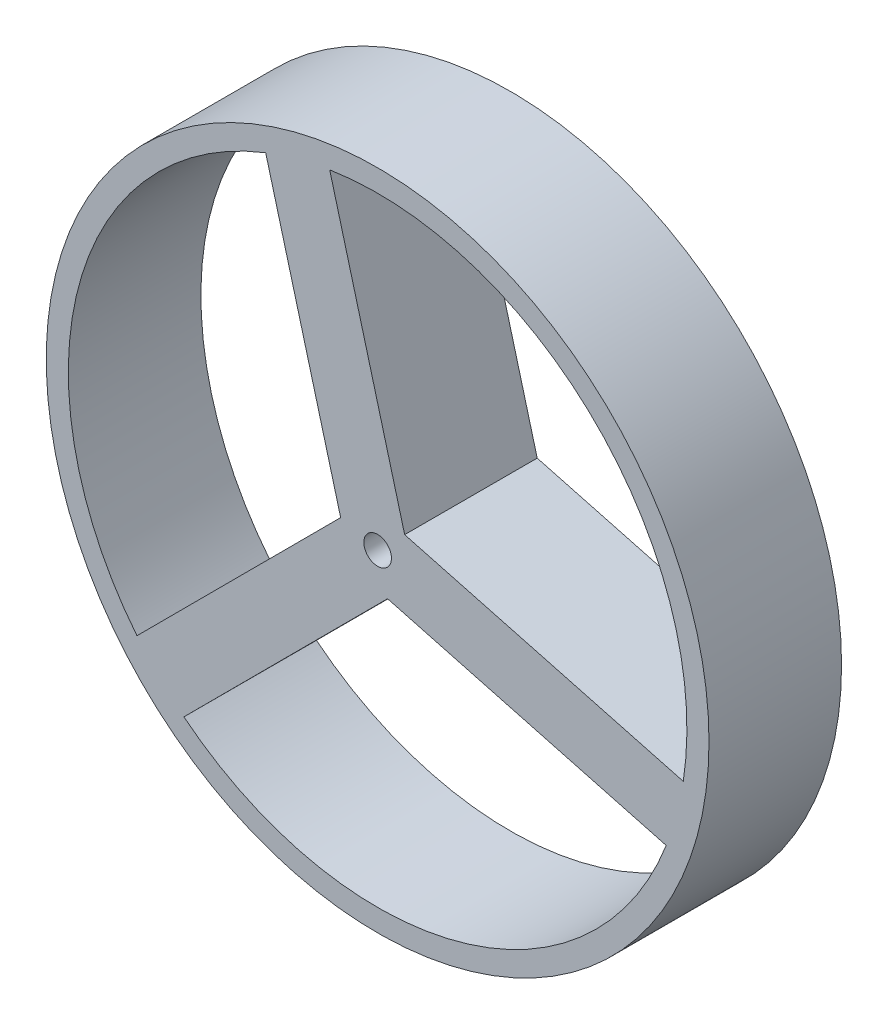
ISO-10303-21;
HEADER;
FILE_DESCRIPTION(('STEP AP214'),'2;1');
FILE_NAME('part.step','',(''),(''),'','','');
FILE_SCHEMA(('AUTOMOTIVE_DESIGN { 1 0 10303 214 1 1 1 1 }'));
ENDSEC;
DATA;
#1=APPLICATION_CONTEXT('core data for automotive mechanical design processes');
#2=APPLICATION_PROTOCOL_DEFINITION('international standard','automotive_design',2000,#1);
#3=PRODUCT_CONTEXT('',#1,'mechanical');
#4=PRODUCT('Part','Part','',(#3));
#5=PRODUCT_RELATED_PRODUCT_CATEGORY('part','',(#4));
#6=PRODUCT_DEFINITION_FORMATION('','',#4);
#7=PRODUCT_DEFINITION_CONTEXT('part definition',#1,'design');
#8=PRODUCT_DEFINITION('design','',#6,#7);
#9=PRODUCT_DEFINITION_SHAPE('','',#8);
#10=(LENGTH_UNIT() NAMED_UNIT(*) SI_UNIT(.MILLI.,.METRE.));
#11=(NAMED_UNIT(*) PLANE_ANGLE_UNIT() SI_UNIT($,.RADIAN.));
#12=(NAMED_UNIT(*) SI_UNIT($,.STERADIAN.) SOLID_ANGLE_UNIT());
#13=UNCERTAINTY_MEASURE_WITH_UNIT(LENGTH_MEASURE(1.E-05),#10,'distance_accuracy_value','');
#14=(GEOMETRIC_REPRESENTATION_CONTEXT(3) GLOBAL_UNCERTAINTY_ASSIGNED_CONTEXT((#13)) GLOBAL_UNIT_ASSIGNED_CONTEXT((#10,
#11,#12)) REPRESENTATION_CONTEXT('',''));
#15=CARTESIAN_POINT('',(0.,0.,0.));
#16=DIRECTION('',(0.,0.,1.));
#17=DIRECTION('',(1.,0.,0.));
#18=AXIS2_PLACEMENT_3D('',#15,#16,#17);
#19=CARTESIAN_POINT('',(0.,0.,12.));
#20=DIRECTION('',(0.,0.,1.));
#21=DIRECTION('',(1.,0.,0.));
#22=AXIS2_PLACEMENT_3D('',#19,#20,#21);
#23=PLANE('',#22);
#24=CARTESIAN_POINT('',(0.,0.,12.));
#25=DIRECTION('',(0.,0.,1.));
#26=DIRECTION('',(1.,0.,0.));
#27=AXIS2_PLACEMENT_3D('',#24,#25,#26);
#28=CIRCLE('',#27,1.25);
#29=CARTESIAN_POINT('',(1.25,0.,12.));
#30=VERTEX_POINT('',#29);
#31=EDGE_CURVE('E360',#30,#30,#28,.T.);
#32=ORIENTED_EDGE('',*,*,#31,.F.);
#33=EDGE_LOOP('',(#32));
#34=FACE_BOUND('',#33,.T.);
#35=CARTESIAN_POINT('',(0.,0.,12.));
#36=DIRECTION('',(0.,0.,1.));
#37=DIRECTION('',(1.,0.,0.));
#38=AXIS2_PLACEMENT_3D('',#35,#36,#37);
#39=CIRCLE('',#38,30.);
#40=CARTESIAN_POINT('',(30.,0.,12.));
#41=VERTEX_POINT('',#40);
#42=EDGE_CURVE('E11',#41,#41,#39,.T.);
#43=ORIENTED_EDGE('',*,*,#42,.T.);
#44=EDGE_LOOP('',(#43));
#45=FACE_BOUND('',#44,.T.);
#46=DIRECTION('',(0.706311058723231,0.707901609212233,0.));
#47=VECTOR('',#46,1.);
#48=CARTESIAN_POINT('',(-3.3470714672931,0.892811622254335,12.));
#49=LINE('',#48,#47);
#50=CARTESIAN_POINT('',(-21.7865725367964,-17.5882135846398,12.));
#51=VERTEX_POINT('',#50);
#52=CARTESIAN_POINT('',(-3.3470714672931,0.892811622254334,12.));
#53=VERTEX_POINT('',#52);
#54=EDGE_CURVE('E185',#51,#53,#49,.T.);
#55=ORIENTED_EDGE('',*,*,#54,.F.);
#56=CARTESIAN_POINT('',(0.,0.,12.));
#57=DIRECTION('',(0.,0.,1.));
#58=DIRECTION('',(1.,0.,0.));
#59=AXIS2_PLACEMENT_3D('',#56,#57,#58);
#60=CIRCLE('',#59,28.);
#61=CARTESIAN_POINT('',(-10.1323582496924,26.1024005850016,12.));
#62=VERTEX_POINT('',#61);
#63=EDGE_CURVE('E182',#62,#51,#60,.T.);
#64=ORIENTED_EDGE('',*,*,#63,.F.);
#65=DIRECTION('',(-0.259905247596065,0.965634124434316,0.));
#66=VECTOR('',#65,1.);
#67=CARTESIAN_POINT('',(-10.1323582496924,26.1024005850016,12.));
#68=LINE('',#67,#66);
#69=EDGE_CURVE('E190',#53,#62,#68,.T.);
#70=ORIENTED_EDGE('',*,*,#69,.F.);
#71=EDGE_LOOP('',(#55,#64,#70));
#72=FACE_BOUND('',#71,.T.);
#73=DIRECTION('',(-0.966216306319294,0.257732515222079,0.));
#74=VECTOR('',#73,1.);
#75=CARTESIAN_POINT('',(0.900338187980306,-3.34505473008504,12.));
#76=LINE('',#75,#74);
#77=CARTESIAN_POINT('',(26.1251260398829,-10.0736184859381,12.));
#78=VERTEX_POINT('',#77);
#79=CARTESIAN_POINT('',(0.900338187980307,-3.34505473008504,12.));
#80=VERTEX_POINT('',#79);
#81=EDGE_CURVE('E152',#78,#80,#76,.T.);
#82=ORIENTED_EDGE('',*,*,#81,.F.);
#83=CARTESIAN_POINT('',(0.,0.,12.));
#84=DIRECTION('',(0.,0.,1.));
#85=DIRECTION('',(1.,0.,0.));
#86=AXIS2_PLACEMENT_3D('',#83,#84,#85);
#87=CIRCLE('',#86,28.);
#88=CARTESIAN_POINT('',(-17.539162881523,-21.8260799369792,12.));
#89=VERTEX_POINT('',#88);
#90=EDGE_CURVE('E149',#89,#78,#87,.T.);
#91=ORIENTED_EDGE('',*,*,#90,.F.);
#92=DIRECTION('',(-0.706311058723231,-0.707901609212233,0.));
#93=VECTOR('',#92,1.);
#94=CARTESIAN_POINT('',(-17.539162881523,-21.8260799369792,12.));
#95=LINE('',#94,#93);
#96=EDGE_CURVE('E157',#80,#89,#95,.T.);
#97=ORIENTED_EDGE('',*,*,#96,.F.);
#98=EDGE_LOOP('',(#82,#91,#97));
#99=FACE_BOUND('',#98,.T.);
#100=DIRECTION('',(0.259905247596064,-0.965634124434316,0.));
#101=VECTOR('',#100,1.);
#102=CARTESIAN_POINT('',(-4.33855350308645,27.661832070578,12.));
#103=LINE('',#102,#101);
#104=CARTESIAN_POINT('',(-4.33855350308645,27.661832070578,12.));
#105=VERTEX_POINT('',#104);
#106=CARTESIAN_POINT('',(2.4467332793128,2.45224310783072,12.));
#107=VERTEX_POINT('',#106);
#108=EDGE_CURVE('E120',#105,#107,#103,.T.);
#109=ORIENTED_EDGE('',*,*,#108,.F.);
#110=CARTESIAN_POINT('',(0.,0.,12.));
#111=DIRECTION('',(0.,0.,1.));
#112=DIRECTION('',(1.,0.,0.));
#113=AXIS2_PLACEMENT_3D('',#110,#111,#112);
#114=CIRCLE('',#113,28.);
#115=CARTESIAN_POINT('',(27.6715211312154,-4.27632064802231,12.));
#116=VERTEX_POINT('',#115);
#117=EDGE_CURVE('E111',#116,#105,#114,.T.);
#118=ORIENTED_EDGE('',*,*,#117,.F.);
#119=DIRECTION('',(0.966216306319295,-0.257732515222079,0.));
#120=VECTOR('',#119,1.);
#121=CARTESIAN_POINT('',(2.4467332793128,2.45224310783072,12.));
#122=LINE('',#121,#120);
#123=EDGE_CURVE('E130',#107,#116,#122,.T.);
#124=ORIENTED_EDGE('',*,*,#123,.F.);
#125=EDGE_LOOP('',(#109,#118,#124));
#126=FACE_BOUND('',#125,.T.);
#127=ADVANCED_FACE('F39',(#34,#45,#72,#99,#126),#23,.T.);
#128=CARTESIAN_POINT('',(0.,0.,0.));
#129=DIRECTION('',(0.,0.,1.));
#130=DIRECTION('',(1.,0.,0.));
#131=AXIS2_PLACEMENT_3D('',#128,#129,#130);
#132=PLANE('',#131);
#133=CARTESIAN_POINT('',(0.,0.,0.));
#134=DIRECTION('',(0.,0.,1.));
#135=DIRECTION('',(1.,0.,0.));
#136=AXIS2_PLACEMENT_3D('',#133,#134,#135);
#137=CIRCLE('',#136,1.25);
#138=CARTESIAN_POINT('',(1.25,0.,0.));
#139=VERTEX_POINT('',#138);
#140=EDGE_CURVE('E139',#139,#139,#137,.T.);
#141=ORIENTED_EDGE('',*,*,#140,.T.);
#142=EDGE_LOOP('',(#141));
#143=FACE_BOUND('',#142,.T.);
#144=CARTESIAN_POINT('',(0.,0.,0.));
#145=DIRECTION('',(0.,0.,1.));
#146=DIRECTION('',(1.,0.,0.));
#147=AXIS2_PLACEMENT_3D('',#144,#145,#146);
#148=CIRCLE('',#147,28.);
#149=CARTESIAN_POINT('',(-17.539162881523,-21.8260799369792,0.));
#150=VERTEX_POINT('',#149);
#151=CARTESIAN_POINT('',(26.1251260398829,-10.0736184859381,0.));
#152=VERTEX_POINT('',#151);
#153=EDGE_CURVE('E128',#150,#152,#148,.T.);
#154=ORIENTED_EDGE('',*,*,#153,.T.);
#155=DIRECTION('',(-0.966216306319294,0.257732515222079,0.));
#156=VECTOR('',#155,1.);
#157=CARTESIAN_POINT('',(0.900338187980306,-3.34505473008504,0.));
#158=LINE('',#157,#156);
#159=CARTESIAN_POINT('',(0.900338187980306,-3.34505473008504,0.));
#160=VERTEX_POINT('',#159);
#161=EDGE_CURVE('E164',#152,#160,#158,.T.);
#162=ORIENTED_EDGE('',*,*,#161,.T.);
#163=DIRECTION('',(-0.706311058723231,-0.707901609212233,0.));
#164=VECTOR('',#163,1.);
#165=CARTESIAN_POINT('',(-17.539162881523,-21.8260799369792,0.));
#166=LINE('',#165,#164);
#167=EDGE_CURVE('E153',#160,#150,#166,.T.);
#168=ORIENTED_EDGE('',*,*,#167,.T.);
#169=EDGE_LOOP('',(#154,#162,#168));
#170=FACE_BOUND('',#169,.T.);
#171=CARTESIAN_POINT('',(0.,0.,0.));
#172=DIRECTION('',(0.,0.,1.));
#173=DIRECTION('',(1.,0.,0.));
#174=AXIS2_PLACEMENT_3D('',#171,#172,#173);
#175=CIRCLE('',#174,30.);
#176=CARTESIAN_POINT('',(30.,0.,0.));
#177=VERTEX_POINT('',#176);
#178=EDGE_CURVE('E43',#177,#177,#175,.T.);
#179=ORIENTED_EDGE('',*,*,#178,.F.);
#180=EDGE_LOOP('',(#179));
#181=FACE_BOUND('',#180,.T.);
#182=CARTESIAN_POINT('',(0.,0.,0.));
#183=DIRECTION('',(0.,0.,1.));
#184=DIRECTION('',(1.,0.,0.));
#185=AXIS2_PLACEMENT_3D('',#182,#183,#184);
#186=CIRCLE('',#185,28.);
#187=CARTESIAN_POINT('',(-10.1323582496924,26.1024005850016,0.));
#188=VERTEX_POINT('',#187);
#189=CARTESIAN_POINT('',(-21.7865725367964,-17.5882135846398,0.));
#190=VERTEX_POINT('',#189);
#191=EDGE_CURVE('E181',#188,#190,#186,.T.);
#192=ORIENTED_EDGE('',*,*,#191,.T.);
#193=DIRECTION('',(0.706311058723231,0.707901609212233,0.));
#194=VECTOR('',#193,1.);
#195=CARTESIAN_POINT('',(-3.3470714672931,0.892811622254335,0.));
#196=LINE('',#195,#194);
#197=CARTESIAN_POINT('',(-3.3470714672931,0.892811622254335,0.));
#198=VERTEX_POINT('',#197);
#199=EDGE_CURVE('E197',#190,#198,#196,.T.);
#200=ORIENTED_EDGE('',*,*,#199,.T.);
#201=DIRECTION('',(-0.259905247596065,0.965634124434316,0.));
#202=VECTOR('',#201,1.);
#203=CARTESIAN_POINT('',(-10.1323582496924,26.1024005850016,0.));
#204=LINE('',#203,#202);
#205=EDGE_CURVE('E186',#198,#188,#204,.T.);
#206=ORIENTED_EDGE('',*,*,#205,.T.);
#207=EDGE_LOOP('',(#192,#200,#206));
#208=FACE_BOUND('',#207,.T.);
#209=CARTESIAN_POINT('',(0.,0.,0.));
#210=DIRECTION('',(0.,0.,1.));
#211=DIRECTION('',(1.,0.,0.));
#212=AXIS2_PLACEMENT_3D('',#209,#210,#211);
#213=CIRCLE('',#212,28.);
#214=CARTESIAN_POINT('',(27.6715211312154,-4.27632064802231,0.));
#215=VERTEX_POINT('',#214);
#216=CARTESIAN_POINT('',(-4.33855350308645,27.661832070578,0.));
#217=VERTEX_POINT('',#216);
#218=EDGE_CURVE('E63',#215,#217,#213,.T.);
#219=ORIENTED_EDGE('',*,*,#218,.T.);
#220=DIRECTION('',(0.259905247596064,-0.965634124434316,0.));
#221=VECTOR('',#220,1.);
#222=CARTESIAN_POINT('',(-4.33855350308645,27.661832070578,0.));
#223=LINE('',#222,#221);
#224=CARTESIAN_POINT('',(2.4467332793128,2.45224310783072,0.));
#225=VERTEX_POINT('',#224);
#226=EDGE_CURVE('E126',#217,#225,#223,.T.);
#227=ORIENTED_EDGE('',*,*,#226,.T.);
#228=DIRECTION('',(0.966216306319295,-0.257732515222079,0.));
#229=VECTOR('',#228,1.);
#230=CARTESIAN_POINT('',(2.4467332793128,2.45224310783072,0.));
#231=LINE('',#230,#229);
#232=EDGE_CURVE('E121',#225,#215,#231,.T.);
#233=ORIENTED_EDGE('',*,*,#232,.T.);
#234=EDGE_LOOP('',(#219,#227,#233));
#235=FACE_BOUND('',#234,.T.);
#236=ADVANCED_FACE('F220',(#143,#170,#181,#208,#235),#132,.F.);
#237=CARTESIAN_POINT('',(0.,0.,12.));
#238=DIRECTION('',(0.,0.,-1.));
#239=DIRECTION('',(-1.,0.,0.));
#240=AXIS2_PLACEMENT_3D('',#237,#238,#239);
#241=CYLINDRICAL_SURFACE('',#240,30.);
#242=ORIENTED_EDGE('',*,*,#42,.F.);
#243=EDGE_LOOP('',(#242));
#244=FACE_BOUND('',#243,.T.);
#245=ORIENTED_EDGE('',*,*,#178,.T.);
#246=EDGE_LOOP('',(#245));
#247=FACE_BOUND('',#246,.T.);
#248=ADVANCED_FACE('F41',(#244,#247),#241,.T.);
#249=CARTESIAN_POINT('',(0.,0.,12.));
#250=DIRECTION('',(0.,0.,-1.));
#251=DIRECTION('',(-1.,0.,0.));
#252=AXIS2_PLACEMENT_3D('',#249,#250,#251);
#253=CYLINDRICAL_SURFACE('',#252,28.);
#254=ORIENTED_EDGE('',*,*,#191,.F.);
#255=DIRECTION('',(0.,0.,-1.));
#256=VECTOR('',#255,1.);
#257=CARTESIAN_POINT('',(-10.1323582496924,26.1024005850016,12.));
#258=LINE('',#257,#256);
#259=EDGE_CURVE('E193',#62,#188,#258,.T.);
#260=ORIENTED_EDGE('',*,*,#259,.F.);
#261=ORIENTED_EDGE('',*,*,#63,.T.);
#262=DIRECTION('',(0.,0.,-1.));
#263=VECTOR('',#262,1.);
#264=CARTESIAN_POINT('',(-21.7865725367964,-17.5882135846398,12.));
#265=LINE('',#264,#263);
#266=EDGE_CURVE('E210',#51,#190,#265,.T.);
#267=ORIENTED_EDGE('',*,*,#266,.T.);
#268=EDGE_LOOP('',(#254,#260,#261,#267));
#269=FACE_BOUND('',#268,.T.);
#270=ADVANCED_FACE('F244',(#269),#253,.F.);
#271=CARTESIAN_POINT('',(-3.3470714672931,0.892811622254335,12.));
#272=DIRECTION('',(-0.707901609212233,0.706311058723231,0.));
#273=DIRECTION('',(-0.706311058723231,-0.707901609212233,0.));
#274=AXIS2_PLACEMENT_3D('',#271,#272,#273);
#275=PLANE('',#274);
#276=ORIENTED_EDGE('',*,*,#199,.F.);
#277=ORIENTED_EDGE('',*,*,#266,.F.);
#278=ORIENTED_EDGE('',*,*,#54,.T.);
#279=DIRECTION('',(0.,0.,-1.));
#280=VECTOR('',#279,1.);
#281=CARTESIAN_POINT('',(-3.3470714672931,0.892811622254335,12.));
#282=LINE('',#281,#280);
#283=EDGE_CURVE('E207',#53,#198,#282,.T.);
#284=ORIENTED_EDGE('',*,*,#283,.T.);
#285=EDGE_LOOP('',(#276,#277,#278,#284));
#286=FACE_BOUND('',#285,.T.);
#287=ADVANCED_FACE('F247',(#286),#275,.T.);
#288=CARTESIAN_POINT('',(-10.1323582496924,26.1024005850016,12.));
#289=DIRECTION('',(-0.965634124434316,-0.259905247596065,0.));
#290=DIRECTION('',(0.259905247596065,-0.965634124434316,0.));
#291=AXIS2_PLACEMENT_3D('',#288,#289,#290);
#292=PLANE('',#291);
#293=ORIENTED_EDGE('',*,*,#205,.F.);
#294=ORIENTED_EDGE('',*,*,#283,.F.);
#295=ORIENTED_EDGE('',*,*,#69,.T.);
#296=ORIENTED_EDGE('',*,*,#259,.T.);
#297=EDGE_LOOP('',(#293,#294,#295,#296));
#298=FACE_BOUND('',#297,.T.);
#299=ADVANCED_FACE('F250',(#298),#292,.T.);
#300=CARTESIAN_POINT('',(0.,0.,12.));
#301=DIRECTION('',(0.,0.,-1.));
#302=DIRECTION('',(-1.,0.,0.));
#303=AXIS2_PLACEMENT_3D('',#300,#301,#302);
#304=CYLINDRICAL_SURFACE('',#303,28.);
#305=ORIENTED_EDGE('',*,*,#153,.F.);
#306=DIRECTION('',(0.,0.,-1.));
#307=VECTOR('',#306,1.);
#308=CARTESIAN_POINT('',(-17.539162881523,-21.8260799369792,12.));
#309=LINE('',#308,#307);
#310=EDGE_CURVE('E160',#89,#150,#309,.T.);
#311=ORIENTED_EDGE('',*,*,#310,.F.);
#312=ORIENTED_EDGE('',*,*,#90,.T.);
#313=DIRECTION('',(0.,0.,-1.));
#314=VECTOR('',#313,1.);
#315=CARTESIAN_POINT('',(26.1251260398829,-10.0736184859381,12.));
#316=LINE('',#315,#314);
#317=EDGE_CURVE('E177',#78,#152,#316,.T.);
#318=ORIENTED_EDGE('',*,*,#317,.T.);
#319=EDGE_LOOP('',(#305,#311,#312,#318));
#320=FACE_BOUND('',#319,.T.);
#321=ADVANCED_FACE('F254',(#320),#304,.F.);
#322=CARTESIAN_POINT('',(0.900338187980306,-3.34505473008504,12.));
#323=DIRECTION('',(-0.257732515222079,-0.966216306319294,0.));
#324=DIRECTION('',(0.966216306319294,-0.257732515222079,0.));
#325=AXIS2_PLACEMENT_3D('',#322,#323,#324);
#326=PLANE('',#325);
#327=ORIENTED_EDGE('',*,*,#161,.F.);
#328=ORIENTED_EDGE('',*,*,#317,.F.);
#329=ORIENTED_EDGE('',*,*,#81,.T.);
#330=DIRECTION('',(0.,0.,-1.));
#331=VECTOR('',#330,1.);
#332=CARTESIAN_POINT('',(0.900338187980306,-3.34505473008504,12.));
#333=LINE('',#332,#331);
#334=EDGE_CURVE('E174',#80,#160,#333,.T.);
#335=ORIENTED_EDGE('',*,*,#334,.T.);
#336=EDGE_LOOP('',(#327,#328,#329,#335));
#337=FACE_BOUND('',#336,.T.);
#338=ADVANCED_FACE('F258',(#337),#326,.T.);
#339=CARTESIAN_POINT('',(-17.539162881523,-21.8260799369792,12.));
#340=DIRECTION('',(0.707901609212233,-0.706311058723231,0.));
#341=DIRECTION('',(0.706311058723231,0.707901609212233,0.));
#342=AXIS2_PLACEMENT_3D('',#339,#340,#341);
#343=PLANE('',#342);
#344=ORIENTED_EDGE('',*,*,#167,.F.);
#345=ORIENTED_EDGE('',*,*,#334,.F.);
#346=ORIENTED_EDGE('',*,*,#96,.T.);
#347=ORIENTED_EDGE('',*,*,#310,.T.);
#348=EDGE_LOOP('',(#344,#345,#346,#347));
#349=FACE_BOUND('',#348,.T.);
#350=ADVANCED_FACE('F262',(#349),#343,.T.);
#351=CARTESIAN_POINT('',(0.,0.,12.));
#352=DIRECTION('',(0.,0.,-1.));
#353=DIRECTION('',(-1.,0.,0.));
#354=AXIS2_PLACEMENT_3D('',#351,#352,#353);
#355=CYLINDRICAL_SURFACE('',#354,28.);
#356=ORIENTED_EDGE('',*,*,#218,.F.);
#357=DIRECTION('',(0.,0.,-1.));
#358=VECTOR('',#357,1.);
#359=CARTESIAN_POINT('',(27.6715211312154,-4.27632064802231,12.));
#360=LINE('',#359,#358);
#361=EDGE_CURVE('E115',#116,#215,#360,.T.);
#362=ORIENTED_EDGE('',*,*,#361,.F.);
#363=ORIENTED_EDGE('',*,*,#117,.T.);
#364=DIRECTION('',(0.,0.,-1.));
#365=VECTOR('',#364,1.);
#366=CARTESIAN_POINT('',(-4.33855350308645,27.661832070578,12.));
#367=LINE('',#366,#365);
#368=EDGE_CURVE('E114',#105,#217,#367,.T.);
#369=ORIENTED_EDGE('',*,*,#368,.T.);
#370=EDGE_LOOP('',(#356,#362,#363,#369));
#371=FACE_BOUND('',#370,.T.);
#372=ADVANCED_FACE('F113',(#371),#355,.F.);
#373=CARTESIAN_POINT('',(-4.33855350308645,27.661832070578,12.));
#374=DIRECTION('',(0.965634124434316,0.259905247596064,0.));
#375=DIRECTION('',(-0.259905247596064,0.965634124434316,0.));
#376=AXIS2_PLACEMENT_3D('',#373,#374,#375);
#377=PLANE('',#376);
#378=ORIENTED_EDGE('',*,*,#226,.F.);
#379=ORIENTED_EDGE('',*,*,#368,.F.);
#380=ORIENTED_EDGE('',*,*,#108,.T.);
#381=DIRECTION('',(0.,0.,-1.));
#382=VECTOR('',#381,1.);
#383=CARTESIAN_POINT('',(2.4467332793128,2.45224310783072,12.));
#384=LINE('',#383,#382);
#385=EDGE_CURVE('E55',#107,#225,#384,.T.);
#386=ORIENTED_EDGE('',*,*,#385,.T.);
#387=EDGE_LOOP('',(#378,#379,#380,#386));
#388=FACE_BOUND('',#387,.T.);
#389=ADVANCED_FACE('F124',(#388),#377,.T.);
#390=CARTESIAN_POINT('',(2.4467332793128,2.45224310783072,12.));
#391=DIRECTION('',(0.257732515222079,0.966216306319294,0.));
#392=DIRECTION('',(-0.966216306319295,0.257732515222079,0.));
#393=AXIS2_PLACEMENT_3D('',#390,#391,#392);
#394=PLANE('',#393);
#395=ORIENTED_EDGE('',*,*,#232,.F.);
#396=ORIENTED_EDGE('',*,*,#385,.F.);
#397=ORIENTED_EDGE('',*,*,#123,.T.);
#398=ORIENTED_EDGE('',*,*,#361,.T.);
#399=EDGE_LOOP('',(#395,#396,#397,#398));
#400=FACE_BOUND('',#399,.T.);
#401=ADVANCED_FACE('F225',(#400),#394,.T.);
#402=CARTESIAN_POINT('',(0.,0.,0.));
#403=DIRECTION('',(0.,0.,1.));
#404=DIRECTION('',(1.,0.,0.));
#405=AXIS2_PLACEMENT_3D('',#402,#403,#404);
#406=CYLINDRICAL_SURFACE('',#405,1.25);
#407=ORIENTED_EDGE('',*,*,#140,.F.);
#408=EDGE_LOOP('',(#407));
#409=FACE_BOUND('',#408,.T.);
#410=ORIENTED_EDGE('',*,*,#31,.T.);
#411=EDGE_LOOP('',(#410));
#412=FACE_BOUND('',#411,.T.);
#413=ADVANCED_FACE('F227',(#409,#412),#406,.F.);
#414=CLOSED_SHELL('',(#127,#236,#248,#270,#287,#299,#321,#338,#350,#372,#389,#401,#413));
#415=MANIFOLD_SOLID_BREP('B2',#414);
#416=ADVANCED_BREP_SHAPE_REPRESENTATION('',(#18,#415),#14);
#417=SHAPE_DEFINITION_REPRESENTATION(#9,#416);
ENDSEC;
END-ISO-10303-21;
